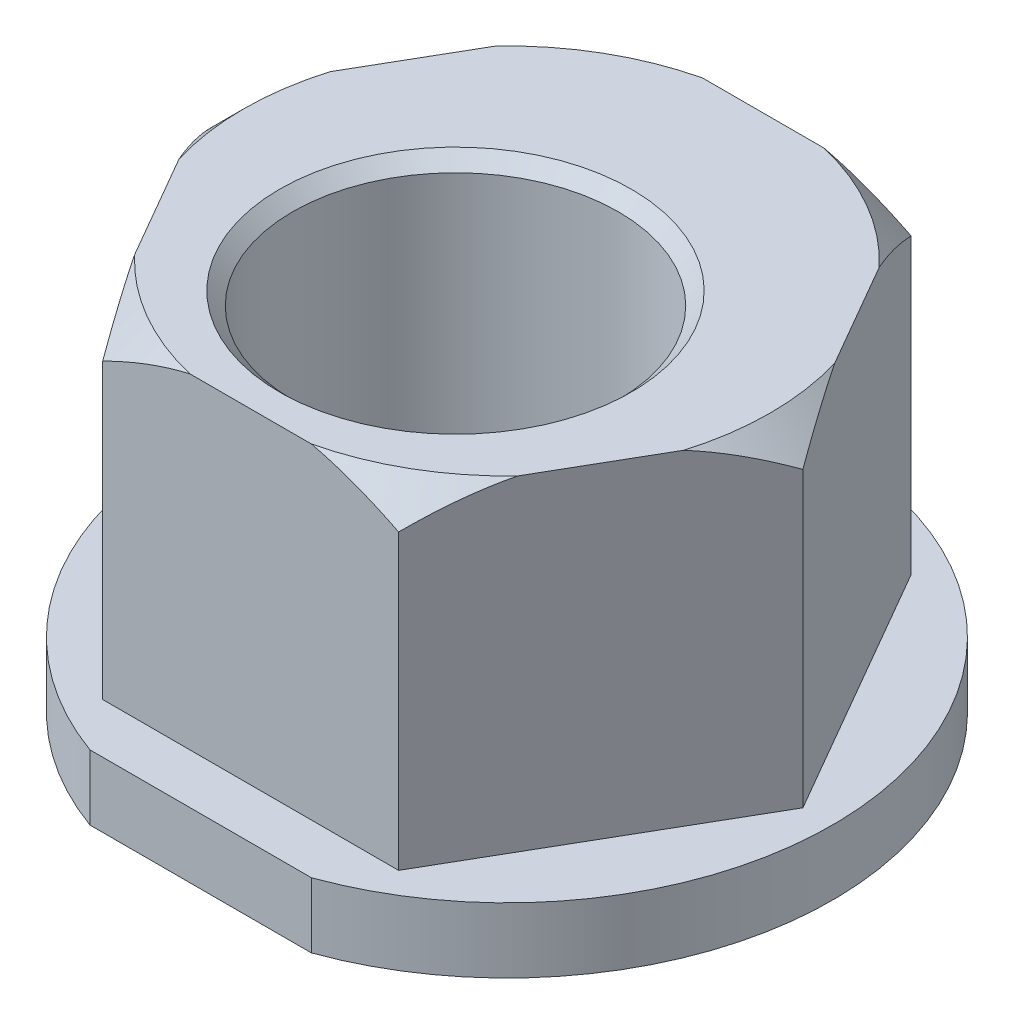
ISO-10303-21;
HEADER;
FILE_DESCRIPTION(('STEP AP214'),'2;1');
FILE_NAME('part.step','',(''),(''),'','','');
FILE_SCHEMA(('AUTOMOTIVE_DESIGN { 1 0 10303 214 1 1 1 1 }'));
ENDSEC;
DATA;
#1=APPLICATION_CONTEXT('core data for automotive mechanical design processes');
#2=APPLICATION_PROTOCOL_DEFINITION('international standard','automotive_design',2000,#1);
#3=PRODUCT_CONTEXT('',#1,'mechanical');
#4=PRODUCT('Part','Part','',(#3));
#5=PRODUCT_RELATED_PRODUCT_CATEGORY('part','',(#4));
#6=PRODUCT_DEFINITION_FORMATION('','',#4);
#7=PRODUCT_DEFINITION_CONTEXT('part definition',#1,'design');
#8=PRODUCT_DEFINITION('design','',#6,#7);
#9=PRODUCT_DEFINITION_SHAPE('','',#8);
#10=(LENGTH_UNIT() NAMED_UNIT(*) SI_UNIT(.MILLI.,.METRE.));
#11=(NAMED_UNIT(*) PLANE_ANGLE_UNIT() SI_UNIT($,.RADIAN.));
#12=(NAMED_UNIT(*) SI_UNIT($,.STERADIAN.) SOLID_ANGLE_UNIT());
#13=UNCERTAINTY_MEASURE_WITH_UNIT(LENGTH_MEASURE(1.E-05),#10,'distance_accuracy_value','');
#14=(GEOMETRIC_REPRESENTATION_CONTEXT(3) GLOBAL_UNCERTAINTY_ASSIGNED_CONTEXT((#13)) GLOBAL_UNIT_ASSIGNED_CONTEXT((#10,
#11,#12)) REPRESENTATION_CONTEXT('',''));
#15=CARTESIAN_POINT('',(0.,0.,0.));
#16=DIRECTION('',(0.,0.,1.));
#17=DIRECTION('',(1.,0.,0.));
#18=AXIS2_PLACEMENT_3D('',#15,#16,#17);
#19=CARTESIAN_POINT('',(-0.931483609523491,-0.9,-3.145));
#20=DIRECTION('',(0.,-1.,0.));
#21=DIRECTION('',(1.,0.,0.));
#22=AXIS2_PLACEMENT_3D('',#19,#20,#21);
#23=CONICAL_SURFACE('',#22,2.6,0.785398163397449);
#24=CARTESIAN_POINT('',(-0.931483609523491,-0.8,-3.145));
#25=DIRECTION('',(0.,1.,0.));
#26=DIRECTION('',(1.,0.,0.));
#27=AXIS2_PLACEMENT_3D('',#24,#25,#26);
#28=CIRCLE('',#27,2.5);
#29=CARTESIAN_POINT('',(-3.43148360952349,-0.8,-3.145));
#30=VERTEX_POINT('',#29);
#31=EDGE_CURVE('E11',#30,#30,#28,.T.);
#32=ORIENTED_EDGE('',*,*,#31,.T.);
#33=EDGE_LOOP('',(#32));
#34=FACE_BOUND('',#33,.T.);
#35=CARTESIAN_POINT('',(-0.931483609523491,-1.,-3.145));
#36=DIRECTION('',(0.,-1.,0.));
#37=DIRECTION('',(1.,0.,0.));
#38=AXIS2_PLACEMENT_3D('',#35,#36,#37);
#39=CIRCLE('',#38,2.7);
#40=CARTESIAN_POINT('',(-3.63148360952349,-1.,-3.145));
#41=VERTEX_POINT('',#40);
#42=EDGE_CURVE('E27',#41,#41,#39,.T.);
#43=ORIENTED_EDGE('',*,*,#42,.T.);
#44=EDGE_LOOP('',(#43));
#45=FACE_BOUND('',#44,.T.);
#46=ADVANCED_FACE('F16',(#34,#45),#23,.F.);
#47=CARTESIAN_POINT('',(-0.931483609523491,0.,-3.145));
#48=DIRECTION('',(0.,1.,0.));
#49=DIRECTION('',(1.,0.,0.));
#50=AXIS2_PLACEMENT_3D('',#47,#48,#49);
#51=CYLINDRICAL_SURFACE('',#50,2.5);
#52=CARTESIAN_POINT('',(-0.931483609523491,4.8,-3.145));
#53=DIRECTION('',(0.,-1.,0.));
#54=DIRECTION('',(1.,0.,0.));
#55=AXIS2_PLACEMENT_3D('',#52,#53,#54);
#56=CIRCLE('',#55,2.5);
#57=CARTESIAN_POINT('',(-3.43148360952349,4.8,-3.145));
#58=VERTEX_POINT('',#57);
#59=EDGE_CURVE('E308',#58,#58,#56,.T.);
#60=ORIENTED_EDGE('',*,*,#59,.F.);
#61=EDGE_LOOP('',(#60));
#62=FACE_BOUND('',#61,.T.);
#63=ORIENTED_EDGE('',*,*,#31,.F.);
#64=EDGE_LOOP('',(#63));
#65=FACE_BOUND('',#64,.T.);
#66=ADVANCED_FACE('F399',(#62,#65),#51,.F.);
#67=CARTESIAN_POINT('',(-0.931483609523509,-1.,-3.80210922732783));
#68=DIRECTION('',(0.,-1.,0.));
#69=DIRECTION('',(0.,0.,-1.));
#70=AXIS2_PLACEMENT_3D('',#67,#68,#69);
#71=PLANE('',#70);
#72=DIRECTION('',(-1.,0.,0.));
#73=VECTOR('',#72,1.);
#74=CARTESIAN_POINT('',(0.768516390476499,-1.,0.767127178204028));
#75=LINE('',#74,#73);
#76=CARTESIAN_POINT('',(0.768516390476499,-1.,0.767127178204028));
#77=VERTEX_POINT('',#76);
#78=CARTESIAN_POINT('',(-2.6314836095235,-1.,0.767127178204028));
#79=VERTEX_POINT('',#78);
#80=EDGE_CURVE('E160',#77,#79,#75,.T.);
#81=ORIENTED_EDGE('',*,*,#80,.T.);
#82=CARTESIAN_POINT('',(-0.931483609523509,-1.,-3.9350000000001));
#83=DIRECTION('',(0.,-1.,0.));
#84=DIRECTION('',(-0.339999999999961,0.,-0.940425435640714));
#85=AXIS2_PLACEMENT_3D('',#82,#83,#84);
#86=CIRCLE('',#85,4.99999999999991);
#87=EDGE_CURVE('E306',#79,#77,#86,.T.);
#88=ORIENTED_EDGE('',*,*,#87,.T.);
#89=EDGE_LOOP('',(#81,#88));
#90=FACE_BOUND('',#89,.T.);
#91=ORIENTED_EDGE('',*,*,#42,.F.);
#92=EDGE_LOOP('',(#91));
#93=FACE_BOUND('',#92,.T.);
#94=ADVANCED_FACE('F18',(#90,#93),#71,.T.);
#95=CARTESIAN_POINT('',(-0.931483609523491,4.9,-3.145));
#96=DIRECTION('',(0.,1.,0.));
#97=DIRECTION('',(1.,0.,0.));
#98=AXIS2_PLACEMENT_3D('',#95,#96,#97);
#99=CONICAL_SURFACE('',#98,2.6,0.785398163397448);
#100=ORIENTED_EDGE('',*,*,#59,.T.);
#101=EDGE_LOOP('',(#100));
#102=FACE_BOUND('',#101,.T.);
#103=CARTESIAN_POINT('',(-0.931483609523491,5.,-3.145));
#104=DIRECTION('',(0.,1.,0.));
#105=DIRECTION('',(1.,0.,0.));
#106=AXIS2_PLACEMENT_3D('',#103,#104,#105);
#107=CIRCLE('',#106,2.7);
#108=CARTESIAN_POINT('',(-3.63148360952349,5.,-3.145));
#109=VERTEX_POINT('',#108);
#110=EDGE_CURVE('E681',#109,#109,#107,.T.);
#111=ORIENTED_EDGE('',*,*,#110,.T.);
#112=EDGE_LOOP('',(#111));
#113=FACE_BOUND('',#112,.T.);
#114=ADVANCED_FACE('F426',(#102,#113),#99,.F.);
#115=CARTESIAN_POINT('',(-0.931483609523476,5.,-3.935));
#116=DIRECTION('',(0.,1.,0.));
#117=DIRECTION('',(0.,0.,1.));
#118=AXIS2_PLACEMENT_3D('',#115,#116,#117);
#119=PLANE('',#118);
#120=CARTESIAN_POINT('',(-0.931483609523485,5.,-3.935));
#121=DIRECTION('',(0.,1.,0.));
#122=DIRECTION('',(1.,0.,0.));
#123=AXIS2_PLACEMENT_3D('',#120,#121,#122);
#124=CIRCLE('',#123,4.04374661852238);
#125=CARTESIAN_POINT('',(-3.87355176865341,5.,-1.16081153094365));
#126=VERTEX_POINT('',#125);
#127=CARTESIAN_POINT('',(-1.86296721904724,5.,0.));
#128=VERTEX_POINT('',#127);
#129=EDGE_CURVE('E314',#126,#128,#124,.T.);
#130=ORIENTED_EDGE('',*,*,#129,.T.);
#131=DIRECTION('',(1.,0.,0.));
#132=VECTOR('',#131,1.);
#133=CARTESIAN_POINT('',(-3.20335691878467,5.,0.));
#134=LINE('',#133,#132);
#135=CARTESIAN_POINT('',(2.66592303788115E-13,5.,0.));
#136=VERTEX_POINT('',#135);
#137=EDGE_CURVE('E310',#128,#136,#134,.T.);
#138=ORIENTED_EDGE('',*,*,#137,.T.);
#139=CARTESIAN_POINT('',(-0.931483609523485,5.,-3.935));
#140=DIRECTION('',(0.,1.,0.));
#141=DIRECTION('',(1.,0.,0.));
#142=AXIS2_PLACEMENT_3D('',#139,#140,#141);
#143=CIRCLE('',#142,4.04374661852238);
#144=CARTESIAN_POINT('',(2.01058454960646,5.,-1.16081153094367));
#145=VERTEX_POINT('',#144);
#146=EDGE_CURVE('E315',#136,#145,#143,.T.);
#147=ORIENTED_EDGE('',*,*,#146,.T.);
#148=DIRECTION('',(0.5,0.,-0.866025403784436));
#149=VECTOR('',#148,1.);
#150=CARTESIAN_POINT('',(1.3403896997377,5.,0.));
#151=LINE('',#150,#149);
#152=CARTESIAN_POINT('',(2.9420681591301,5.,-2.77418846905624));
#153=VERTEX_POINT('',#152);
#154=EDGE_CURVE('E238',#145,#153,#151,.T.);
#155=ORIENTED_EDGE('',*,*,#154,.T.);
#156=CARTESIAN_POINT('',(-0.931483609523485,5.,-3.935));
#157=DIRECTION('',(0.,1.,0.));
#158=DIRECTION('',(1.,0.,0.));
#159=AXIS2_PLACEMENT_3D('',#156,#157,#158);
#160=CIRCLE('',#159,4.04374661852238);
#161=CARTESIAN_POINT('',(2.94206815913008,5.,-5.09581153094376));
#162=VERTEX_POINT('',#161);
#163=EDGE_CURVE('E286',#153,#162,#160,.T.);
#164=ORIENTED_EDGE('',*,*,#163,.T.);
#165=DIRECTION('',(-0.500000000000007,0.,-0.866025403784435));
#166=VECTOR('',#165,1.);
#167=CARTESIAN_POINT('',(3.6122630089989,5.,-3.935));
#168=LINE('',#167,#166);
#169=CARTESIAN_POINT('',(2.01058454960648,5.,-6.70918846905627));
#170=VERTEX_POINT('',#169);
#171=EDGE_CURVE('E208',#162,#170,#168,.T.);
#172=ORIENTED_EDGE('',*,*,#171,.T.);
#173=CARTESIAN_POINT('',(-0.931483609523485,5.,-3.935));
#174=DIRECTION('',(0.,1.,0.));
#175=DIRECTION('',(1.,0.,0.));
#176=AXIS2_PLACEMENT_3D('',#173,#174,#175);
#177=CIRCLE('',#176,4.04374661852238);
#178=CARTESIAN_POINT('',(2.66592303788115E-13,5.,-7.87));
#179=VERTEX_POINT('',#178);
#180=EDGE_CURVE('E204',#170,#179,#177,.T.);
#181=ORIENTED_EDGE('',*,*,#180,.T.);
#182=DIRECTION('',(-1.,0.,0.));
#183=VECTOR('',#182,1.);
#184=CARTESIAN_POINT('',(1.3403896997377,5.,-7.87));
#185=LINE('',#184,#183);
#186=CARTESIAN_POINT('',(-1.86296721904724,5.,-7.87));
#187=VERTEX_POINT('',#186);
#188=EDGE_CURVE('E209',#179,#187,#185,.T.);
#189=ORIENTED_EDGE('',*,*,#188,.T.);
#190=CARTESIAN_POINT('',(-0.931483609523485,5.,-3.935));
#191=DIRECTION('',(0.,1.,0.));
#192=DIRECTION('',(1.,0.,0.));
#193=AXIS2_PLACEMENT_3D('',#190,#191,#192);
#194=CIRCLE('',#193,4.04374661852238);
#195=CARTESIAN_POINT('',(-3.87355176865342,5.,-6.70918846905629));
#196=VERTEX_POINT('',#195);
#197=EDGE_CURVE('E211',#187,#196,#194,.T.);
#198=ORIENTED_EDGE('',*,*,#197,.T.);
#199=DIRECTION('',(-0.5,0.,0.866025403784437));
#200=VECTOR('',#199,1.);
#201=CARTESIAN_POINT('',(-3.20335691878467,5.,-7.87));
#202=LINE('',#201,#200);
#203=CARTESIAN_POINT('',(-4.80503537817707,5.,-5.0958115309437));
#204=VERTEX_POINT('',#203);
#205=EDGE_CURVE('E137',#196,#204,#202,.T.);
#206=ORIENTED_EDGE('',*,*,#205,.T.);
#207=CARTESIAN_POINT('',(-0.931483609523485,5.,-3.935));
#208=DIRECTION('',(0.,1.,0.));
#209=DIRECTION('',(1.,0.,0.));
#210=AXIS2_PLACEMENT_3D('',#207,#208,#209);
#211=CIRCLE('',#210,4.04374661852238);
#212=CARTESIAN_POINT('',(-4.80503537817709,5.,-2.77418846905631));
#213=VERTEX_POINT('',#212);
#214=EDGE_CURVE('E130',#204,#213,#211,.T.);
#215=ORIENTED_EDGE('',*,*,#214,.T.);
#216=DIRECTION('',(0.5,0.,0.866025403784439));
#217=VECTOR('',#216,1.);
#218=CARTESIAN_POINT('',(-5.47523022804584,5.,-3.935));
#219=LINE('',#218,#217);
#220=EDGE_CURVE('E116',#213,#126,#219,.T.);
#221=ORIENTED_EDGE('',*,*,#220,.T.);
#222=EDGE_LOOP('',(#130,#138,#147,#155,#164,#172,#181,#189,#198,#206,#215,#221));
#223=FACE_BOUND('',#222,.T.);
#224=ORIENTED_EDGE('',*,*,#110,.F.);
#225=EDGE_LOOP('',(#224));
#226=FACE_BOUND('',#225,.T.);
#227=ADVANCED_FACE('F134',(#223,#226),#119,.T.);
#228=CARTESIAN_POINT('',(-0.931483609523485,4.75,-3.935));
#229=DIRECTION('',(0.,-1.,0.));
#230=DIRECTION('',(1.,0.,0.));
#231=AXIS2_PLACEMENT_3D('',#228,#229,#230);
#232=CONICAL_SURFACE('',#231,4.29374661852239,0.785398163397448);
#233=CARTESIAN_POINT('',(1.34038969973766,4.5,-7.87));
#234=CARTESIAN_POINT('',(1.69499790713702,4.85460820739935,-7.25580056800343));
#235=CARTESIAN_POINT('',(2.01058454960648,5.,-6.70918846905626));
#236=(BOUNDED_CURVE() B_SPLINE_CURVE(2,(#233,#234,#235),.UNSPECIFIED.,.F.,
.F.) B_SPLINE_CURVE_WITH_KNOTS((3,3),(0.,0.143313309602928),
.UNSPECIFIED.) CURVE() GEOMETRIC_REPRESENTATION_ITEM() RATIONAL_B_SPLINE_CURVE((1.,
1.01240865964598,1.)) REPRESENTATION_ITEM(''));
#237=CARTESIAN_POINT('',(1.34038969973779,4.5,-7.87));
#238=VERTEX_POINT('',#237);
#239=EDGE_CURVE('E305',#238,#170,#236,.T.);
#240=ORIENTED_EDGE('',*,*,#239,.F.);
#241=CARTESIAN_POINT('',(2.61067209517129E-13,5.,-7.87));
#242=CARTESIAN_POINT('',(0.631173284939131,4.85460820739934,-7.86999999999996));
#243=CARTESIAN_POINT('',(1.34038969973779,4.5,-7.87));
#244=(BOUNDED_CURVE() B_SPLINE_CURVE(2,(#241,#242,#243),.UNSPECIFIED.,.F.,
.F.) B_SPLINE_CURVE_WITH_KNOTS((3,3),(0.,0.143313309602919),
.UNSPECIFIED.) CURVE() GEOMETRIC_REPRESENTATION_ITEM() RATIONAL_B_SPLINE_CURVE((1.,
1.01240865964601,1.)) REPRESENTATION_ITEM(''));
#245=EDGE_CURVE('E267',#179,#238,#244,.T.);
#246=ORIENTED_EDGE('',*,*,#245,.F.);
#247=ORIENTED_EDGE('',*,*,#180,.F.);
#248=EDGE_LOOP('',(#240,#246,#247));
#249=FACE_BOUND('',#248,.T.);
#250=ADVANCED_FACE('F430',(#249),#232,.T.);
#251=CARTESIAN_POINT('',(-0.931483609523485,4.75,-3.935));
#252=DIRECTION('',(0.,-1.,0.));
#253=DIRECTION('',(1.,0.,0.));
#254=AXIS2_PLACEMENT_3D('',#251,#252,#253);
#255=CONICAL_SURFACE('',#254,4.29374661852239,0.785398163397448);
#256=CARTESIAN_POINT('',(-3.20335691878476,4.5,-7.87));
#257=CARTESIAN_POINT('',(-2.4941405039861,4.85460820739935,-7.86999999999997));
#258=CARTESIAN_POINT('',(-1.86296721904723,5.,-7.87));
#259=(BOUNDED_CURVE() B_SPLINE_CURVE(2,(#256,#257,#258),.UNSPECIFIED.,.F.,
.F.) B_SPLINE_CURVE_WITH_KNOTS((3,3),(0.,0.143313309602919),
.UNSPECIFIED.) CURVE() GEOMETRIC_REPRESENTATION_ITEM() RATIONAL_B_SPLINE_CURVE((1.,
1.01240865964602,1.)) REPRESENTATION_ITEM(''));
#260=CARTESIAN_POINT('',(-3.20335691878462,4.5,-7.87));
#261=VERTEX_POINT('',#260);
#262=EDGE_CURVE('E232',#261,#187,#259,.T.);
#263=ORIENTED_EDGE('',*,*,#262,.F.);
#264=CARTESIAN_POINT('',(-3.87355176865342,5.,-6.70918846905629));
#265=CARTESIAN_POINT('',(-3.55796512618397,4.85460820739935,-7.25580056800344));
#266=CARTESIAN_POINT('',(-3.20335691878462,4.5,-7.87));
#267=(BOUNDED_CURVE() B_SPLINE_CURVE(2,(#264,#265,#266),.UNSPECIFIED.,.F.,
.F.) B_SPLINE_CURVE_WITH_KNOTS((3,3),(0.,0.143313309602925),
.UNSPECIFIED.) CURVE() GEOMETRIC_REPRESENTATION_ITEM() RATIONAL_B_SPLINE_CURVE((1.,
1.01240865964593,1.)) REPRESENTATION_ITEM(''));
#268=EDGE_CURVE('E215',#196,#261,#267,.T.);
#269=ORIENTED_EDGE('',*,*,#268,.F.);
#270=ORIENTED_EDGE('',*,*,#197,.F.);
#271=EDGE_LOOP('',(#263,#269,#270));
#272=FACE_BOUND('',#271,.T.);
#273=ADVANCED_FACE('F414',(#272),#255,.T.);
#274=CARTESIAN_POINT('',(-0.931483609523485,4.75,-3.935));
#275=DIRECTION('',(0.,-1.,0.));
#276=DIRECTION('',(1.,0.,0.));
#277=AXIS2_PLACEMENT_3D('',#274,#275,#276);
#278=CONICAL_SURFACE('',#277,4.29374661852239,0.785398163397448);
#279=CARTESIAN_POINT('',(-5.47523022804587,4.5,-3.93499999999995));
#280=CARTESIAN_POINT('',(-5.12062202064651,4.85460820739934,-4.54919943199653));
#281=CARTESIAN_POINT('',(-4.80503537817707,5.,-5.0958115309437));
#282=(BOUNDED_CURVE() B_SPLINE_CURVE(2,(#279,#280,#281),.UNSPECIFIED.,.F.,
.F.) B_SPLINE_CURVE_WITH_KNOTS((3,3),(0.,0.143313309602925),
.UNSPECIFIED.) CURVE() GEOMETRIC_REPRESENTATION_ITEM() RATIONAL_B_SPLINE_CURVE((1.,
1.012408659646,1.)) REPRESENTATION_ITEM(''));
#283=CARTESIAN_POINT('',(-5.47523022804587,4.5,-3.93500000000005));
#284=VERTEX_POINT('',#283);
#285=EDGE_CURVE('E143',#284,#204,#282,.T.);
#286=ORIENTED_EDGE('',*,*,#285,.F.);
#287=CARTESIAN_POINT('',(-4.80503537817709,5.,-2.77418846905631));
#288=CARTESIAN_POINT('',(-5.12062202064653,4.85460820739935,-3.32080056800346));
#289=CARTESIAN_POINT('',(-5.47523022804587,4.5,-3.935));
#290=(BOUNDED_CURVE() B_SPLINE_CURVE(2,(#287,#288,#289),.UNSPECIFIED.,.F.,
.F.) B_SPLINE_CURVE_WITH_KNOTS((3,3),(0.,0.143313309602922),
.UNSPECIFIED.) CURVE() GEOMETRIC_REPRESENTATION_ITEM() RATIONAL_B_SPLINE_CURVE((1.,
1.01240865964597,1.)) REPRESENTATION_ITEM(''));
#291=EDGE_CURVE('E121',#213,#284,#290,.T.);
#292=ORIENTED_EDGE('',*,*,#291,.F.);
#293=ORIENTED_EDGE('',*,*,#214,.F.);
#294=EDGE_LOOP('',(#286,#292,#293));
#295=FACE_BOUND('',#294,.T.);
#296=ADVANCED_FACE('F142',(#295),#278,.T.);
#297=CARTESIAN_POINT('',(-0.931483609523485,4.75,-3.935));
#298=DIRECTION('',(0.,-1.,0.));
#299=DIRECTION('',(1.,0.,0.));
#300=AXIS2_PLACEMENT_3D('',#297,#298,#299);
#301=CONICAL_SURFACE('',#300,4.29374661852239,0.785398163397448);
#302=CARTESIAN_POINT('',(3.6122630089989,4.5,-3.935));
#303=CARTESIAN_POINT('',(3.25765480159954,4.85460820739934,-3.3208005680034));
#304=CARTESIAN_POINT('',(2.9420681591301,5.,-2.77418846905624));
#305=(BOUNDED_CURVE() B_SPLINE_CURVE(2,(#302,#303,#304),.UNSPECIFIED.,.F.,
.F.) B_SPLINE_CURVE_WITH_KNOTS((3,3),(0.,0.143313309602925),
.UNSPECIFIED.) CURVE() GEOMETRIC_REPRESENTATION_ITEM() RATIONAL_B_SPLINE_CURVE((1.,
1.01240865964594,1.)) REPRESENTATION_ITEM(''));
#306=CARTESIAN_POINT('',(3.6122630089989,4.5,-3.935));
#307=VERTEX_POINT('',#306);
#308=EDGE_CURVE('E162',#307,#153,#305,.T.);
#309=ORIENTED_EDGE('',*,*,#308,.F.);
#310=CARTESIAN_POINT('',(2.94206815913008,5.,-5.09581153094377));
#311=CARTESIAN_POINT('',(3.25765480159954,4.85460820739936,-4.5491994319966));
#312=CARTESIAN_POINT('',(3.6122630089989,4.5,-3.935));
#313=(BOUNDED_CURVE() B_SPLINE_CURVE(2,(#310,#311,#312),.UNSPECIFIED.,.F.,
.F.) B_SPLINE_CURVE_WITH_KNOTS((3,3),(0.,0.143313309602928),
.UNSPECIFIED.) CURVE() GEOMETRIC_REPRESENTATION_ITEM() RATIONAL_B_SPLINE_CURVE((1.,
1.01240865964597,1.)) REPRESENTATION_ITEM(''));
#314=EDGE_CURVE('E325',#162,#307,#313,.T.);
#315=ORIENTED_EDGE('',*,*,#314,.F.);
#316=ORIENTED_EDGE('',*,*,#163,.F.);
#317=EDGE_LOOP('',(#309,#315,#316));
#318=FACE_BOUND('',#317,.T.);
#319=ADVANCED_FACE('F381',(#318),#301,.T.);
#320=CARTESIAN_POINT('',(-0.931483609523485,4.75,-3.935));
#321=DIRECTION('',(0.,-1.,0.));
#322=DIRECTION('',(1.,0.,0.));
#323=AXIS2_PLACEMENT_3D('',#320,#321,#322);
#324=CONICAL_SURFACE('',#323,4.29374661852239,0.785398163397448);
#325=CARTESIAN_POINT('',(2.01058454960646,5.,-1.16081153094368));
#326=CARTESIAN_POINT('',(1.69499790713701,4.85460820739936,-0.614199431996512));
#327=CARTESIAN_POINT('',(1.34038969973766,4.5,0.));
#328=(BOUNDED_CURVE() B_SPLINE_CURVE(2,(#325,#326,#327),.UNSPECIFIED.,.F.,
.F.) B_SPLINE_CURVE_WITH_KNOTS((3,3),(0.,0.143313309602925),
.UNSPECIFIED.) CURVE() GEOMETRIC_REPRESENTATION_ITEM() RATIONAL_B_SPLINE_CURVE((1.,
1.01240865964597,1.)) REPRESENTATION_ITEM(''));
#329=CARTESIAN_POINT('',(1.34038969973779,4.5,0.));
#330=VERTEX_POINT('',#329);
#331=EDGE_CURVE('E240',#145,#330,#328,.T.);
#332=ORIENTED_EDGE('',*,*,#331,.F.);
#333=ORIENTED_EDGE('',*,*,#146,.F.);
#334=CARTESIAN_POINT('',(1.34038969973779,4.5,0.));
#335=CARTESIAN_POINT('',(0.631173284939131,4.85460820739934,0.));
#336=CARTESIAN_POINT('',(2.61067209517129E-13,5.,0.));
#337=(BOUNDED_CURVE() B_SPLINE_CURVE(2,(#334,#335,#336),.UNSPECIFIED.,.F.,
.F.) B_SPLINE_CURVE_WITH_KNOTS((3,3),(0.,0.143313309602919),
.UNSPECIFIED.) CURVE() GEOMETRIC_REPRESENTATION_ITEM() RATIONAL_B_SPLINE_CURVE((1.,
1.01240865964597,1.)) REPRESENTATION_ITEM(''));
#338=EDGE_CURVE('E152',#330,#136,#337,.T.);
#339=ORIENTED_EDGE('',*,*,#338,.F.);
#340=EDGE_LOOP('',(#332,#333,#339));
#341=FACE_BOUND('',#340,.T.);
#342=ADVANCED_FACE('F385',(#341),#324,.T.);
#343=CARTESIAN_POINT('',(-0.931483609523485,4.75,-3.935));
#344=DIRECTION('',(0.,-1.,0.));
#345=DIRECTION('',(1.,0.,0.));
#346=AXIS2_PLACEMENT_3D('',#343,#344,#345);
#347=CONICAL_SURFACE('',#346,4.29374661852239,0.785398163397448);
#348=CARTESIAN_POINT('',(-3.20335691878462,4.5,0.));
#349=CARTESIAN_POINT('',(-3.55796512618397,4.85460820739935,-0.614199431996503));
#350=CARTESIAN_POINT('',(-3.87355176865341,5.,-1.16081153094365));
#351=(BOUNDED_CURVE() B_SPLINE_CURVE(2,(#348,#349,#350),.UNSPECIFIED.,.F.,
.F.) B_SPLINE_CURVE_WITH_KNOTS((3,3),(0.,0.143313309602922),
.UNSPECIFIED.) CURVE() GEOMETRIC_REPRESENTATION_ITEM() RATIONAL_B_SPLINE_CURVE((1.,
1.01240865964597,1.)) REPRESENTATION_ITEM(''));
#352=CARTESIAN_POINT('',(-3.20335691878476,4.5,0.));
#353=VERTEX_POINT('',#352);
#354=EDGE_CURVE('E125',#353,#126,#351,.T.);
#355=ORIENTED_EDGE('',*,*,#354,.F.);
#356=CARTESIAN_POINT('',(-1.86296721904723,5.,0.));
#357=CARTESIAN_POINT('',(-2.4941405039861,4.85460820739934,0.));
#358=CARTESIAN_POINT('',(-3.20335691878476,4.5,0.));
#359=(BOUNDED_CURVE() B_SPLINE_CURVE(2,(#356,#357,#358),.UNSPECIFIED.,.F.,
.F.) B_SPLINE_CURVE_WITH_KNOTS((3,3),(0.,0.143313309602919),
.UNSPECIFIED.) CURVE() GEOMETRIC_REPRESENTATION_ITEM() RATIONAL_B_SPLINE_CURVE((1.,
1.012408659646,1.)) REPRESENTATION_ITEM(''));
#360=EDGE_CURVE('E131',#128,#353,#359,.T.);
#361=ORIENTED_EDGE('',*,*,#360,.F.);
#362=ORIENTED_EDGE('',*,*,#129,.F.);
#363=EDGE_LOOP('',(#355,#361,#362));
#364=FACE_BOUND('',#363,.T.);
#365=ADVANCED_FACE('F387',(#364),#347,.T.);
#366=CARTESIAN_POINT('',(-3.20335691878467,0.,0.));
#367=DIRECTION('',(0.,0.,1.));
#368=DIRECTION('',(1.,0.,0.));
#369=AXIS2_PLACEMENT_3D('',#366,#367,#368);
#370=PLANE('',#369);
#371=ORIENTED_EDGE('',*,*,#360,.T.);
#372=DIRECTION('',(0.,1.,0.));
#373=VECTOR('',#372,1.);
#374=CARTESIAN_POINT('',(-3.20335691878467,0.,0.));
#375=LINE('',#374,#373);
#376=CARTESIAN_POINT('',(-3.20335691878467,0.,0.));
#377=VERTEX_POINT('',#376);
#378=EDGE_CURVE('E145',#377,#353,#375,.T.);
#379=ORIENTED_EDGE('',*,*,#378,.F.);
#380=DIRECTION('',(-1.,0.,0.));
#381=VECTOR('',#380,1.);
#382=CARTESIAN_POINT('',(-2.06742026415409,0.,0.));
#383=LINE('',#382,#381);
#384=CARTESIAN_POINT('',(1.3403896997377,0.,0.));
#385=VERTEX_POINT('',#384);
#386=EDGE_CURVE('E187',#385,#377,#383,.T.);
#387=ORIENTED_EDGE('',*,*,#386,.F.);
#388=DIRECTION('',(0.,1.,0.));
#389=VECTOR('',#388,1.);
#390=CARTESIAN_POINT('',(1.3403896997377,0.,0.));
#391=LINE('',#390,#389);
#392=EDGE_CURVE('E257',#385,#330,#391,.T.);
#393=ORIENTED_EDGE('',*,*,#392,.T.);
#394=ORIENTED_EDGE('',*,*,#338,.T.);
#395=ORIENTED_EDGE('',*,*,#137,.F.);
#396=EDGE_LOOP('',(#371,#379,#387,#393,#394,#395));
#397=FACE_BOUND('',#396,.T.);
#398=ADVANCED_FACE('F365',(#397),#370,.T.);
#399=CARTESIAN_POINT('',(-5.47523022804584,0.,-3.935));
#400=DIRECTION('',(-0.866025403784439,0.,0.5));
#401=DIRECTION('',(0.5,0.,0.866025403784439));
#402=AXIS2_PLACEMENT_3D('',#399,#400,#401);
#403=PLANE('',#402);
#404=ORIENTED_EDGE('',*,*,#354,.T.);
#405=ORIENTED_EDGE('',*,*,#220,.F.);
#406=ORIENTED_EDGE('',*,*,#291,.T.);
#407=DIRECTION('',(0.,1.,0.));
#408=VECTOR('',#407,1.);
#409=CARTESIAN_POINT('',(-5.47523022804584,0.,-3.935));
#410=LINE('',#409,#408);
#411=CARTESIAN_POINT('',(-5.47523022804584,0.,-3.935));
#412=VERTEX_POINT('',#411);
#413=EDGE_CURVE('E224',#412,#284,#410,.T.);
#414=ORIENTED_EDGE('',*,*,#413,.F.);
#415=DIRECTION('',(-0.5,0.,-0.866025403784439));
#416=VECTOR('',#415,1.);
#417=CARTESIAN_POINT('',(-4.87849020446489,0.,-2.90141596024794));
#418=LINE('',#417,#416);
#419=EDGE_CURVE('E195',#377,#412,#418,.T.);
#420=ORIENTED_EDGE('',*,*,#419,.F.);
#421=ORIENTED_EDGE('',*,*,#378,.T.);
#422=EDGE_LOOP('',(#404,#405,#406,#414,#420,#421));
#423=FACE_BOUND('',#422,.T.);
#424=ADVANCED_FACE('F118',(#423),#403,.T.);
#425=CARTESIAN_POINT('',(-3.20335691878467,0.,-7.87));
#426=DIRECTION('',(-0.866025403784437,0.,-0.5));
#427=DIRECTION('',(-0.5,0.,0.866025403784437));
#428=AXIS2_PLACEMENT_3D('',#425,#426,#427);
#429=PLANE('',#428);
#430=ORIENTED_EDGE('',*,*,#285,.T.);
#431=ORIENTED_EDGE('',*,*,#205,.F.);
#432=ORIENTED_EDGE('',*,*,#268,.T.);
#433=DIRECTION('',(0.,1.,0.));
#434=VECTOR('',#433,1.);
#435=CARTESIAN_POINT('',(-3.20335691878467,0.,-7.87));
#436=LINE('',#435,#434);
#437=CARTESIAN_POINT('',(-3.20335691878467,0.,-7.87));
#438=VERTEX_POINT('',#437);
#439=EDGE_CURVE('E299',#438,#261,#436,.T.);
#440=ORIENTED_EDGE('',*,*,#439,.F.);
#441=DIRECTION('',(0.5,0.,-0.866025403784437));
#442=VECTOR('',#441,1.);
#443=CARTESIAN_POINT('',(-3.80009694236561,0.,-6.83641596024791));
#444=LINE('',#443,#442);
#445=EDGE_CURVE('E199',#412,#438,#444,.T.);
#446=ORIENTED_EDGE('',*,*,#445,.F.);
#447=ORIENTED_EDGE('',*,*,#413,.T.);
#448=EDGE_LOOP('',(#430,#431,#432,#440,#446,#447));
#449=FACE_BOUND('',#448,.T.);
#450=ADVANCED_FACE('F417',(#449),#429,.T.);
#451=CARTESIAN_POINT('',(1.3403896997377,0.,-7.87));
#452=DIRECTION('',(0.,0.,-1.));
#453=DIRECTION('',(-1.,0.,0.));
#454=AXIS2_PLACEMENT_3D('',#451,#452,#453);
#455=PLANE('',#454);
#456=ORIENTED_EDGE('',*,*,#262,.T.);
#457=ORIENTED_EDGE('',*,*,#188,.F.);
#458=ORIENTED_EDGE('',*,*,#245,.T.);
#459=DIRECTION('',(0.,1.,0.));
#460=VECTOR('',#459,1.);
#461=CARTESIAN_POINT('',(1.3403896997377,0.,-7.87));
#462=LINE('',#461,#460);
#463=CARTESIAN_POINT('',(1.3403896997377,0.,-7.87));
#464=VERTEX_POINT('',#463);
#465=EDGE_CURVE('E249',#464,#238,#462,.T.);
#466=ORIENTED_EDGE('',*,*,#465,.F.);
#467=DIRECTION('',(1.,0.,0.));
#468=VECTOR('',#467,1.);
#469=CARTESIAN_POINT('',(0.204453045107096,0.,-7.87));
#470=LINE('',#469,#468);
#471=EDGE_CURVE('E281',#438,#464,#470,.T.);
#472=ORIENTED_EDGE('',*,*,#471,.F.);
#473=ORIENTED_EDGE('',*,*,#439,.T.);
#474=EDGE_LOOP('',(#456,#457,#458,#466,#472,#473));
#475=FACE_BOUND('',#474,.T.);
#476=ADVANCED_FACE('F374',(#475),#455,.T.);
#477=CARTESIAN_POINT('',(3.6122630089989,0.,-3.935));
#478=DIRECTION('',(0.866025403784434,0.,-0.500000000000007));
#479=DIRECTION('',(-0.500000000000007,0.,-0.866025403784434));
#480=AXIS2_PLACEMENT_3D('',#477,#478,#479);
#481=PLANE('',#480);
#482=ORIENTED_EDGE('',*,*,#239,.T.);
#483=ORIENTED_EDGE('',*,*,#171,.F.);
#484=ORIENTED_EDGE('',*,*,#314,.T.);
#485=DIRECTION('',(0.,1.,0.));
#486=VECTOR('',#485,1.);
#487=CARTESIAN_POINT('',(3.6122630089989,0.,-3.935));
#488=LINE('',#487,#486);
#489=CARTESIAN_POINT('',(3.6122630089989,0.,-3.935));
#490=VERTEX_POINT('',#489);
#491=EDGE_CURVE('E170',#490,#307,#488,.T.);
#492=ORIENTED_EDGE('',*,*,#491,.F.);
#493=DIRECTION('',(0.500000000000007,0.,0.866025403784435));
#494=VECTOR('',#493,1.);
#495=CARTESIAN_POINT('',(3.07306637794924,0.,-4.86891596024796));
#496=LINE('',#495,#494);
#497=EDGE_CURVE('E285',#464,#490,#496,.T.);
#498=ORIENTED_EDGE('',*,*,#497,.F.);
#499=ORIENTED_EDGE('',*,*,#465,.T.);
#500=EDGE_LOOP('',(#482,#483,#484,#492,#498,#499));
#501=FACE_BOUND('',#500,.T.);
#502=ADVANCED_FACE('F377',(#501),#481,.T.);
#503=CARTESIAN_POINT('',(1.3403896997377,0.,0.));
#504=DIRECTION('',(0.866025403784436,0.,0.5));
#505=DIRECTION('',(0.5,0.,-0.866025403784436));
#506=AXIS2_PLACEMENT_3D('',#503,#504,#505);
#507=PLANE('',#506);
#508=ORIENTED_EDGE('',*,*,#331,.T.);
#509=ORIENTED_EDGE('',*,*,#392,.F.);
#510=DIRECTION('',(-0.5,0.,0.866025403784436));
#511=VECTOR('',#510,1.);
#512=CARTESIAN_POINT('',(1.87958633078733,0.,-0.933915960247921));
#513=LINE('',#512,#511);
#514=EDGE_CURVE('E20',#490,#385,#513,.T.);
#515=ORIENTED_EDGE('',*,*,#514,.F.);
#516=ORIENTED_EDGE('',*,*,#491,.T.);
#517=ORIENTED_EDGE('',*,*,#308,.T.);
#518=ORIENTED_EDGE('',*,*,#154,.F.);
#519=EDGE_LOOP('',(#508,#509,#515,#516,#517,#518));
#520=FACE_BOUND('',#519,.T.);
#521=ADVANCED_FACE('F361',(#520),#507,.T.);
#522=CARTESIAN_POINT('',(-0.931483609523509,0.,-3.9350000000001));
#523=DIRECTION('',(0.,1.,0.));
#524=DIRECTION('',(-0.339999999999961,0.,-0.940425435640714));
#525=AXIS2_PLACEMENT_3D('',#522,#523,#524);
#526=CYLINDRICAL_SURFACE('',#525,4.99999999999991);
#527=CARTESIAN_POINT('',(-0.931483609523509,0.,-3.9350000000001));
#528=DIRECTION('',(0.,-1.,0.));
#529=DIRECTION('',(-0.339999999999961,0.,-0.940425435640714));
#530=AXIS2_PLACEMENT_3D('',#527,#528,#529);
#531=CIRCLE('',#530,4.99999999999991);
#532=CARTESIAN_POINT('',(-2.6314836095235,0.,0.767127178204028));
#533=VERTEX_POINT('',#532);
#534=CARTESIAN_POINT('',(0.768516390476499,0.,0.767127178204028));
#535=VERTEX_POINT('',#534);
#536=EDGE_CURVE('E171',#533,#535,#531,.T.);
#537=ORIENTED_EDGE('',*,*,#536,.T.);
#538=DIRECTION('',(0.,-1.,0.));
#539=VECTOR('',#538,1.);
#540=CARTESIAN_POINT('',(0.768516390476499,0.,0.767127178204028));
#541=LINE('',#540,#539);
#542=EDGE_CURVE('E177',#535,#77,#541,.T.);
#543=ORIENTED_EDGE('',*,*,#542,.T.);
#544=ORIENTED_EDGE('',*,*,#87,.F.);
#545=DIRECTION('',(0.,-1.,0.));
#546=VECTOR('',#545,1.);
#547=CARTESIAN_POINT('',(-2.6314836095235,0.,0.767127178204028));
#548=LINE('',#547,#546);
#549=EDGE_CURVE('E178',#533,#79,#548,.T.);
#550=ORIENTED_EDGE('',*,*,#549,.F.);
#551=EDGE_LOOP('',(#537,#543,#544,#550));
#552=FACE_BOUND('',#551,.T.);
#553=ADVANCED_FACE('F419',(#552),#526,.T.);
#554=CARTESIAN_POINT('',(0.768516390476499,0.,0.767127178204028));
#555=DIRECTION('',(0.,0.,1.));
#556=DIRECTION('',(-1.,0.,0.));
#557=AXIS2_PLACEMENT_3D('',#554,#555,#556);
#558=PLANE('',#557);
#559=DIRECTION('',(-1.,0.,0.));
#560=VECTOR('',#559,1.);
#561=CARTESIAN_POINT('',(0.768516390476499,0.,0.767127178204028));
#562=LINE('',#561,#560);
#563=EDGE_CURVE('E172',#535,#533,#562,.T.);
#564=ORIENTED_EDGE('',*,*,#563,.T.);
#565=ORIENTED_EDGE('',*,*,#549,.T.);
#566=ORIENTED_EDGE('',*,*,#80,.F.);
#567=ORIENTED_EDGE('',*,*,#542,.F.);
#568=EDGE_LOOP('',(#564,#565,#566,#567));
#569=FACE_BOUND('',#568,.T.);
#570=ADVANCED_FACE('F412',(#569),#558,.T.);
#571=CARTESIAN_POINT('',(-0.931483609523509,0.,-3.80210922732783));
#572=DIRECTION('',(0.,-1.,0.));
#573=DIRECTION('',(0.,0.,-1.));
#574=AXIS2_PLACEMENT_3D('',#571,#572,#573);
#575=PLANE('',#574);
#576=ORIENTED_EDGE('',*,*,#386,.T.);
#577=ORIENTED_EDGE('',*,*,#419,.T.);
#578=ORIENTED_EDGE('',*,*,#445,.T.);
#579=ORIENTED_EDGE('',*,*,#471,.T.);
#580=ORIENTED_EDGE('',*,*,#497,.T.);
#581=ORIENTED_EDGE('',*,*,#514,.T.);
#582=EDGE_LOOP('',(#576,#577,#578,#579,#580,#581));
#583=FACE_BOUND('',#582,.T.);
#584=ORIENTED_EDGE('',*,*,#563,.F.);
#585=ORIENTED_EDGE('',*,*,#536,.F.);
#586=EDGE_LOOP('',(#584,#585));
#587=FACE_BOUND('',#586,.T.);
#588=ADVANCED_FACE('F356',(#583,#587),#575,.F.);
#589=CLOSED_SHELL('',(#46,#66,#94,#114,#227,#250,#273,#296,#319,#342,#365,#398,#424,#450,#476,
#502,#521,#553,#570,#588));
#590=MANIFOLD_SOLID_BREP('B1',#589);
#591=ADVANCED_BREP_SHAPE_REPRESENTATION('',(#18,#590),#14);
#592=SHAPE_DEFINITION_REPRESENTATION(#9,#591);
ENDSEC;
END-ISO-10303-21;
